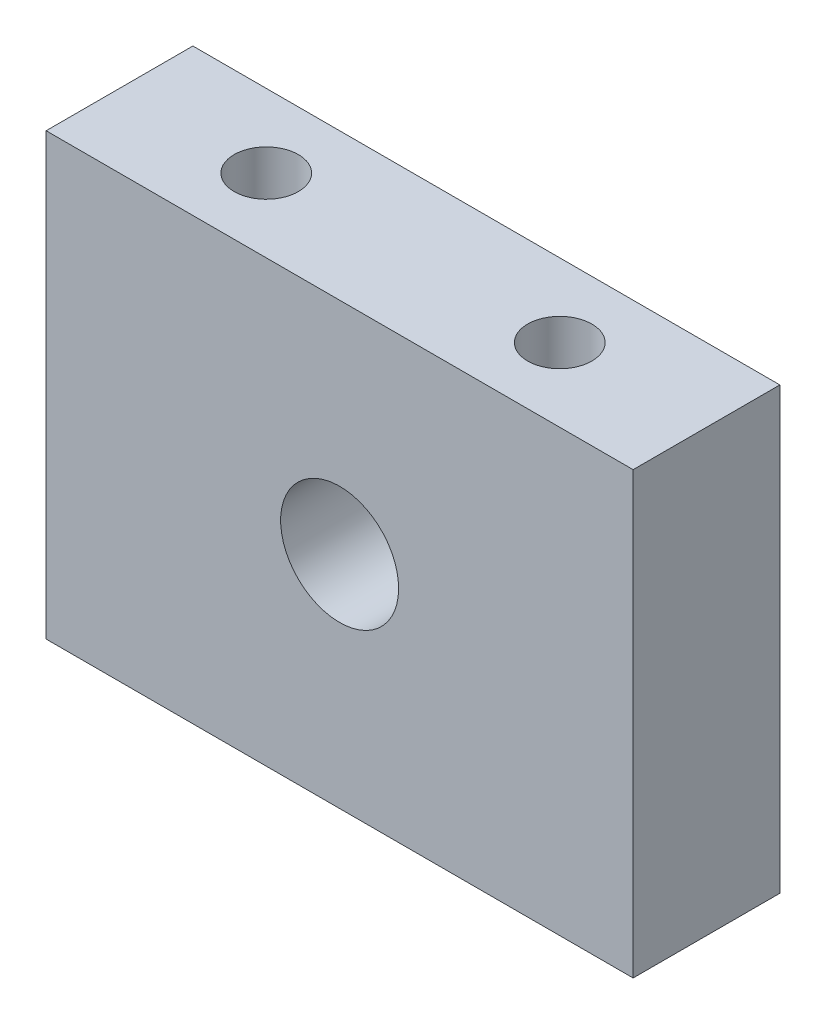
ISO-10303-21;
HEADER;
FILE_DESCRIPTION(('STEP AP214'),'2;1');
FILE_NAME('part.step','',(''),(''),'','','');
FILE_SCHEMA(('AUTOMOTIVE_DESIGN { 1 0 10303 214 1 1 1 1 }'));
ENDSEC;
DATA;
#1=APPLICATION_CONTEXT('core data for automotive mechanical design processes');
#2=APPLICATION_PROTOCOL_DEFINITION('international standard','automotive_design',2000,#1);
#3=PRODUCT_CONTEXT('',#1,'mechanical');
#4=PRODUCT('Part','Part','',(#3));
#5=PRODUCT_RELATED_PRODUCT_CATEGORY('part','',(#4));
#6=PRODUCT_DEFINITION_FORMATION('','',#4);
#7=PRODUCT_DEFINITION_CONTEXT('part definition',#1,'design');
#8=PRODUCT_DEFINITION('design','',#6,#7);
#9=PRODUCT_DEFINITION_SHAPE('','',#8);
#10=(LENGTH_UNIT() NAMED_UNIT(*) SI_UNIT(.MILLI.,.METRE.));
#11=(NAMED_UNIT(*) PLANE_ANGLE_UNIT() SI_UNIT($,.RADIAN.));
#12=(NAMED_UNIT(*) SI_UNIT($,.STERADIAN.) SOLID_ANGLE_UNIT());
#13=UNCERTAINTY_MEASURE_WITH_UNIT(LENGTH_MEASURE(1.E-05),#10,'distance_accuracy_value','');
#14=(GEOMETRIC_REPRESENTATION_CONTEXT(3) GLOBAL_UNCERTAINTY_ASSIGNED_CONTEXT((#13)) GLOBAL_UNIT_ASSIGNED_CONTEXT((#10,
#11,#12)) REPRESENTATION_CONTEXT('',''));
#15=CARTESIAN_POINT('',(0.,0.,0.));
#16=DIRECTION('',(0.,0.,1.));
#17=DIRECTION('',(1.,0.,0.));
#18=AXIS2_PLACEMENT_3D('',#15,#16,#17);
#19=CARTESIAN_POINT('',(6.35,3.175,0.));
#20=DIRECTION('',(0.,-1.,0.));
#21=DIRECTION('',(0.,0.,-1.));
#22=AXIS2_PLACEMENT_3D('',#19,#20,#21);
#23=PLANE('',#22);
#24=CARTESIAN_POINT('',(6.35,3.175,0.));
#25=DIRECTION('',(0.,1.,0.));
#26=DIRECTION('',(0.,0.,1.));
#27=AXIS2_PLACEMENT_3D('',#24,#25,#26);
#28=CIRCLE('',#27,1.3890625);
#29=CARTESIAN_POINT('',(6.35,3.175,1.3890625));
#30=VERTEX_POINT('',#29);
#31=EDGE_CURVE('E20',#30,#30,#28,.T.);
#32=ORIENTED_EDGE('',*,*,#31,.T.);
#33=EDGE_LOOP('',(#32));
#34=FACE_BOUND('',#33,.T.);
#35=ADVANCED_FACE('F17',(#34),#23,.F.);
#36=CARTESIAN_POINT('',(-6.35,3.175,0.));
#37=DIRECTION('',(0.,1.,0.));
#38=DIRECTION('',(0.,0.,1.));
#39=AXIS2_PLACEMENT_3D('',#36,#37,#38);
#40=PLANE('',#39);
#41=CARTESIAN_POINT('',(-6.35,3.175,0.));
#42=DIRECTION('',(0.,1.,0.));
#43=DIRECTION('',(0.,0.,1.));
#44=AXIS2_PLACEMENT_3D('',#41,#42,#43);
#45=CIRCLE('',#44,1.3890625);
#46=CARTESIAN_POINT('',(-6.35,3.175,1.3890625));
#47=VERTEX_POINT('',#46);
#48=EDGE_CURVE('E109',#47,#47,#45,.T.);
#49=ORIENTED_EDGE('',*,*,#48,.T.);
#50=EDGE_LOOP('',(#49));
#51=FACE_BOUND('',#50,.T.);
#52=ADVANCED_FACE('F175',(#51),#40,.T.);
#53=CARTESIAN_POINT('',(-6.34999999999999,-3.175,0.));
#54=DIRECTION('',(0.,1.,0.));
#55=DIRECTION('',(0.,0.,1.));
#56=AXIS2_PLACEMENT_3D('',#53,#54,#55);
#57=PLANE('',#56);
#58=CARTESIAN_POINT('',(-6.34999999999999,-3.175,0.));
#59=DIRECTION('',(0.,-1.,0.));
#60=DIRECTION('',(0.,0.,-1.));
#61=AXIS2_PLACEMENT_3D('',#58,#59,#60);
#62=CIRCLE('',#61,1.3890625);
#63=CARTESIAN_POINT('',(-6.34999999999999,-3.175,-1.3890625));
#64=VERTEX_POINT('',#63);
#65=EDGE_CURVE('E107',#64,#64,#62,.T.);
#66=ORIENTED_EDGE('',*,*,#65,.T.);
#67=EDGE_LOOP('',(#66));
#68=FACE_BOUND('',#67,.T.);
#69=ADVANCED_FACE('F172',(#68),#57,.F.);
#70=CARTESIAN_POINT('',(6.35,-3.175,0.));
#71=DIRECTION('',(0.,-1.,0.));
#72=DIRECTION('',(0.,0.,-1.));
#73=AXIS2_PLACEMENT_3D('',#70,#71,#72);
#74=PLANE('',#73);
#75=CARTESIAN_POINT('',(6.35,-3.175,0.));
#76=DIRECTION('',(0.,-1.,0.));
#77=DIRECTION('',(0.,0.,-1.));
#78=AXIS2_PLACEMENT_3D('',#75,#76,#77);
#79=CIRCLE('',#78,1.3890625);
#80=CARTESIAN_POINT('',(6.35,-3.175,-1.3890625));
#81=VERTEX_POINT('',#80);
#82=EDGE_CURVE('E104',#81,#81,#79,.T.);
#83=ORIENTED_EDGE('',*,*,#82,.T.);
#84=EDGE_LOOP('',(#83));
#85=FACE_BOUND('',#84,.T.);
#86=ADVANCED_FACE('F121',(#85),#74,.T.);
#87=CARTESIAN_POINT('',(6.35,3.175,0.));
#88=DIRECTION('',(0.,1.,0.));
#89=DIRECTION('',(0.,0.,1.));
#90=AXIS2_PLACEMENT_3D('',#87,#88,#89);
#91=CYLINDRICAL_SURFACE('',#90,1.3890625);
#92=ORIENTED_EDGE('',*,*,#31,.F.);
#93=EDGE_LOOP('',(#92));
#94=FACE_BOUND('',#93,.T.);
#95=CARTESIAN_POINT('',(6.35,9.525,0.));
#96=DIRECTION('',(0.,1.,0.));
#97=DIRECTION('',(0.,0.,1.));
#98=AXIS2_PLACEMENT_3D('',#95,#96,#97);
#99=CIRCLE('',#98,1.3890625);
#100=CARTESIAN_POINT('',(6.35,9.525,1.3890625));
#101=VERTEX_POINT('',#100);
#102=EDGE_CURVE('E69',#101,#101,#99,.T.);
#103=ORIENTED_EDGE('',*,*,#102,.T.);
#104=EDGE_LOOP('',(#103));
#105=FACE_BOUND('',#104,.T.);
#106=ADVANCED_FACE('F117',(#94,#105),#91,.F.);
#107=CARTESIAN_POINT('',(-6.35,3.175,0.));
#108=DIRECTION('',(0.,1.,0.));
#109=DIRECTION('',(0.,0.,1.));
#110=AXIS2_PLACEMENT_3D('',#107,#108,#109);
#111=CYLINDRICAL_SURFACE('',#110,1.3890625);
#112=ORIENTED_EDGE('',*,*,#48,.F.);
#113=EDGE_LOOP('',(#112));
#114=FACE_BOUND('',#113,.T.);
#115=CARTESIAN_POINT('',(-6.35,9.525,0.));
#116=DIRECTION('',(0.,1.,0.));
#117=DIRECTION('',(0.,0.,1.));
#118=AXIS2_PLACEMENT_3D('',#115,#116,#117);
#119=CIRCLE('',#118,1.3890625);
#120=CARTESIAN_POINT('',(-6.35,9.525,1.3890625));
#121=VERTEX_POINT('',#120);
#122=EDGE_CURVE('E83',#121,#121,#119,.T.);
#123=ORIENTED_EDGE('',*,*,#122,.T.);
#124=EDGE_LOOP('',(#123));
#125=FACE_BOUND('',#124,.T.);
#126=ADVANCED_FACE('F120',(#114,#125),#111,.F.);
#127=CARTESIAN_POINT('',(-6.34999999999999,-3.175,0.));
#128=DIRECTION('',(0.,-1.,0.));
#129=DIRECTION('',(0.,0.,-1.));
#130=AXIS2_PLACEMENT_3D('',#127,#128,#129);
#131=CYLINDRICAL_SURFACE('',#130,1.3890625);
#132=ORIENTED_EDGE('',*,*,#65,.F.);
#133=EDGE_LOOP('',(#132));
#134=FACE_BOUND('',#133,.T.);
#135=CARTESIAN_POINT('',(-6.34999999999999,-9.525,0.));
#136=DIRECTION('',(0.,-1.,0.));
#137=DIRECTION('',(0.,0.,-1.));
#138=AXIS2_PLACEMENT_3D('',#135,#136,#137);
#139=CIRCLE('',#138,1.3890625);
#140=CARTESIAN_POINT('',(-6.34999999999999,-9.525,-1.3890625));
#141=VERTEX_POINT('',#140);
#142=EDGE_CURVE('E97',#141,#141,#139,.T.);
#143=ORIENTED_EDGE('',*,*,#142,.T.);
#144=EDGE_LOOP('',(#143));
#145=FACE_BOUND('',#144,.T.);
#146=ADVANCED_FACE('F160',(#134,#145),#131,.F.);
#147=CARTESIAN_POINT('',(6.35,-3.175,0.));
#148=DIRECTION('',(0.,-1.,0.));
#149=DIRECTION('',(0.,0.,-1.));
#150=AXIS2_PLACEMENT_3D('',#147,#148,#149);
#151=CYLINDRICAL_SURFACE('',#150,1.3890625);
#152=ORIENTED_EDGE('',*,*,#82,.F.);
#153=EDGE_LOOP('',(#152));
#154=FACE_BOUND('',#153,.T.);
#155=CARTESIAN_POINT('',(6.35,-9.525,0.));
#156=DIRECTION('',(0.,-1.,0.));
#157=DIRECTION('',(0.,0.,-1.));
#158=AXIS2_PLACEMENT_3D('',#155,#156,#157);
#159=CIRCLE('',#158,1.3890625);
#160=CARTESIAN_POINT('',(6.35,-9.525,-1.3890625));
#161=VERTEX_POINT('',#160);
#162=EDGE_CURVE('E94',#161,#161,#159,.T.);
#163=ORIENTED_EDGE('',*,*,#162,.T.);
#164=EDGE_LOOP('',(#163));
#165=FACE_BOUND('',#164,.T.);
#166=ADVANCED_FACE('F155',(#154,#165),#151,.F.);
#167=CARTESIAN_POINT('',(0.,0.,-3.175));
#168=DIRECTION('',(0.,0.,1.));
#169=DIRECTION('',(1.,0.,0.));
#170=AXIS2_PLACEMENT_3D('',#167,#168,#169);
#171=PLANE('',#170);
#172=DIRECTION('',(1.,0.,0.));
#173=VECTOR('',#172,1.);
#174=CARTESIAN_POINT('',(-12.7,-9.525,-3.175));
#175=LINE('',#174,#173);
#176=CARTESIAN_POINT('',(12.7,-9.525,-3.175));
#177=VERTEX_POINT('',#176);
#178=CARTESIAN_POINT('',(-12.7,-9.525,-3.175));
#179=VERTEX_POINT('',#178);
#180=EDGE_CURVE('E93',#177,#179,#175,.F.);
#181=ORIENTED_EDGE('',*,*,#180,.T.);
#182=DIRECTION('',(0.,1.,0.));
#183=VECTOR('',#182,1.);
#184=CARTESIAN_POINT('',(-12.7,9.525,-3.175));
#185=LINE('',#184,#183);
#186=CARTESIAN_POINT('',(-12.7,9.525,-3.175));
#187=VERTEX_POINT('',#186);
#188=EDGE_CURVE('E74',#179,#187,#185,.T.);
#189=ORIENTED_EDGE('',*,*,#188,.T.);
#190=DIRECTION('',(1.,0.,0.));
#191=VECTOR('',#190,1.);
#192=CARTESIAN_POINT('',(-12.7,9.525,-3.175));
#193=LINE('',#192,#191);
#194=CARTESIAN_POINT('',(12.7,9.525,-3.175));
#195=VERTEX_POINT('',#194);
#196=EDGE_CURVE('E55',#187,#195,#193,.T.);
#197=ORIENTED_EDGE('',*,*,#196,.T.);
#198=DIRECTION('',(0.,-1.,0.));
#199=VECTOR('',#198,1.);
#200=CARTESIAN_POINT('',(12.7,9.525,-3.175));
#201=LINE('',#200,#199);
#202=EDGE_CURVE('E60',#195,#177,#201,.T.);
#203=ORIENTED_EDGE('',*,*,#202,.T.);
#204=EDGE_LOOP('',(#181,#189,#197,#203));
#205=FACE_BOUND('',#204,.T.);
#206=CARTESIAN_POINT('',(0.,0.,-3.175));
#207=DIRECTION('',(0.,0.,1.));
#208=DIRECTION('',(1.,0.,0.));
#209=AXIS2_PLACEMENT_3D('',#206,#207,#208);
#210=CIRCLE('',#209,2.5527);
#211=CARTESIAN_POINT('',(2.5527,0.,-3.175));
#212=VERTEX_POINT('',#211);
#213=EDGE_CURVE('E70',#212,#212,#210,.T.);
#214=ORIENTED_EDGE('',*,*,#213,.T.);
#215=EDGE_LOOP('',(#214));
#216=FACE_BOUND('',#215,.T.);
#217=ADVANCED_FACE('F72',(#205,#216),#171,.F.);
#218=CARTESIAN_POINT('',(0.,0.,-3.175));
#219=DIRECTION('',(0.,0.,1.));
#220=DIRECTION('',(1.,0.,0.));
#221=AXIS2_PLACEMENT_3D('',#218,#219,#220);
#222=CYLINDRICAL_SURFACE('',#221,2.5527);
#223=CARTESIAN_POINT('',(0.,0.,3.175));
#224=DIRECTION('',(0.,0.,1.));
#225=DIRECTION('',(1.,0.,0.));
#226=AXIS2_PLACEMENT_3D('',#223,#224,#225);
#227=CIRCLE('',#226,2.5527);
#228=CARTESIAN_POINT('',(2.5527,0.,3.175));
#229=VERTEX_POINT('',#228);
#230=EDGE_CURVE('E89',#229,#229,#227,.F.);
#231=ORIENTED_EDGE('',*,*,#230,.F.);
#232=EDGE_LOOP('',(#231));
#233=FACE_BOUND('',#232,.T.);
#234=ORIENTED_EDGE('',*,*,#213,.F.);
#235=EDGE_LOOP('',(#234));
#236=FACE_BOUND('',#235,.T.);
#237=ADVANCED_FACE('F135',(#233,#236),#222,.F.);
#238=CARTESIAN_POINT('',(12.7,9.525,3.175));
#239=DIRECTION('',(-1.,0.,0.));
#240=DIRECTION('',(0.,-1.,0.));
#241=AXIS2_PLACEMENT_3D('',#238,#239,#240);
#242=PLANE('',#241);
#243=DIRECTION('',(0.,0.,-1.));
#244=VECTOR('',#243,1.);
#245=CARTESIAN_POINT('',(12.7,9.525,3.175));
#246=LINE('',#245,#244);
#247=CARTESIAN_POINT('',(12.7,9.525,3.175));
#248=VERTEX_POINT('',#247);
#249=EDGE_CURVE('E62',#195,#248,#246,.F.);
#250=ORIENTED_EDGE('',*,*,#249,.T.);
#251=DIRECTION('',(0.,1.,0.));
#252=VECTOR('',#251,1.);
#253=CARTESIAN_POINT('',(12.7,0.,3.175));
#254=LINE('',#253,#252);
#255=CARTESIAN_POINT('',(12.7,-9.525,3.175));
#256=VERTEX_POINT('',#255);
#257=EDGE_CURVE('E92',#256,#248,#254,.T.);
#258=ORIENTED_EDGE('',*,*,#257,.F.);
#259=DIRECTION('',(0.,0.,1.));
#260=VECTOR('',#259,1.);
#261=CARTESIAN_POINT('',(12.7,-9.525,3.175));
#262=LINE('',#261,#260);
#263=EDGE_CURVE('E65',#256,#177,#262,.F.);
#264=ORIENTED_EDGE('',*,*,#263,.T.);
#265=ORIENTED_EDGE('',*,*,#202,.F.);
#266=EDGE_LOOP('',(#250,#258,#264,#265));
#267=FACE_BOUND('',#266,.T.);
#268=ADVANCED_FACE('F61',(#267),#242,.F.);
#269=CARTESIAN_POINT('',(-12.7,9.525,3.175));
#270=DIRECTION('',(0.,-1.,0.));
#271=DIRECTION('',(0.,0.,-1.));
#272=AXIS2_PLACEMENT_3D('',#269,#270,#271);
#273=PLANE('',#272);
#274=DIRECTION('',(0.,0.,1.));
#275=VECTOR('',#274,1.);
#276=CARTESIAN_POINT('',(-12.7,9.525,3.175));
#277=LINE('',#276,#275);
#278=CARTESIAN_POINT('',(-12.7,9.525,3.175));
#279=VERTEX_POINT('',#278);
#280=EDGE_CURVE('E76',#187,#279,#277,.T.);
#281=ORIENTED_EDGE('',*,*,#280,.T.);
#282=DIRECTION('',(1.,0.,0.));
#283=VECTOR('',#282,1.);
#284=CARTESIAN_POINT('',(0.,9.525,3.175));
#285=LINE('',#284,#283);
#286=EDGE_CURVE('E81',#248,#279,#285,.F.);
#287=ORIENTED_EDGE('',*,*,#286,.F.);
#288=ORIENTED_EDGE('',*,*,#249,.F.);
#289=ORIENTED_EDGE('',*,*,#196,.F.);
#290=EDGE_LOOP('',(#281,#287,#288,#289));
#291=FACE_BOUND('',#290,.T.);
#292=ORIENTED_EDGE('',*,*,#122,.F.);
#293=EDGE_LOOP('',(#292));
#294=FACE_BOUND('',#293,.T.);
#295=ORIENTED_EDGE('',*,*,#102,.F.);
#296=EDGE_LOOP('',(#295));
#297=FACE_BOUND('',#296,.T.);
#298=ADVANCED_FACE('F78',(#291,#294,#297),#273,.F.);
#299=CARTESIAN_POINT('',(-12.7,9.525,3.175));
#300=DIRECTION('',(1.,0.,0.));
#301=DIRECTION('',(0.,1.,0.));
#302=AXIS2_PLACEMENT_3D('',#299,#300,#301);
#303=PLANE('',#302);
#304=DIRECTION('',(0.,0.,1.));
#305=VECTOR('',#304,1.);
#306=CARTESIAN_POINT('',(-12.7,-9.525,3.175));
#307=LINE('',#306,#305);
#308=CARTESIAN_POINT('',(-12.7,-9.525,3.175));
#309=VERTEX_POINT('',#308);
#310=EDGE_CURVE('E35',#179,#309,#307,.T.);
#311=ORIENTED_EDGE('',*,*,#310,.T.);
#312=DIRECTION('',(0.,1.,0.));
#313=VECTOR('',#312,1.);
#314=CARTESIAN_POINT('',(-12.7,0.,3.175));
#315=LINE('',#314,#313);
#316=EDGE_CURVE('E26',#279,#309,#315,.F.);
#317=ORIENTED_EDGE('',*,*,#316,.F.);
#318=ORIENTED_EDGE('',*,*,#280,.F.);
#319=ORIENTED_EDGE('',*,*,#188,.F.);
#320=EDGE_LOOP('',(#311,#317,#318,#319));
#321=FACE_BOUND('',#320,.T.);
#322=ADVANCED_FACE('F126',(#321),#303,.F.);
#323=CARTESIAN_POINT('',(-12.7,-9.525,3.175));
#324=DIRECTION('',(0.,1.,0.));
#325=DIRECTION('',(0.,0.,1.));
#326=AXIS2_PLACEMENT_3D('',#323,#324,#325);
#327=PLANE('',#326);
#328=ORIENTED_EDGE('',*,*,#263,.F.);
#329=DIRECTION('',(1.,0.,0.));
#330=VECTOR('',#329,1.);
#331=CARTESIAN_POINT('',(0.,-9.525,3.175));
#332=LINE('',#331,#330);
#333=EDGE_CURVE('E11',#309,#256,#332,.T.);
#334=ORIENTED_EDGE('',*,*,#333,.F.);
#335=ORIENTED_EDGE('',*,*,#310,.F.);
#336=ORIENTED_EDGE('',*,*,#180,.F.);
#337=EDGE_LOOP('',(#328,#334,#335,#336));
#338=FACE_BOUND('',#337,.T.);
#339=ORIENTED_EDGE('',*,*,#162,.F.);
#340=EDGE_LOOP('',(#339));
#341=FACE_BOUND('',#340,.T.);
#342=ORIENTED_EDGE('',*,*,#142,.F.);
#343=EDGE_LOOP('',(#342));
#344=FACE_BOUND('',#343,.T.);
#345=ADVANCED_FACE('F133',(#338,#341,#344),#327,.F.);
#346=CARTESIAN_POINT('',(0.,0.,3.175));
#347=DIRECTION('',(0.,0.,1.));
#348=DIRECTION('',(1.,0.,0.));
#349=AXIS2_PLACEMENT_3D('',#346,#347,#348);
#350=PLANE('',#349);
#351=ORIENTED_EDGE('',*,*,#316,.T.);
#352=ORIENTED_EDGE('',*,*,#333,.T.);
#353=ORIENTED_EDGE('',*,*,#257,.T.);
#354=ORIENTED_EDGE('',*,*,#286,.T.);
#355=EDGE_LOOP('',(#351,#352,#353,#354));
#356=FACE_BOUND('',#355,.T.);
#357=ORIENTED_EDGE('',*,*,#230,.T.);
#358=EDGE_LOOP('',(#357));
#359=FACE_BOUND('',#358,.T.);
#360=ADVANCED_FACE('F137',(#356,#359),#350,.T.);
#361=CLOSED_SHELL('',(#35,#52,#69,#86,#106,#126,#146,#166,#217,#237,#268,#298,#322,#345,#360));
#362=MANIFOLD_SOLID_BREP('B1',#361);
#363=ADVANCED_BREP_SHAPE_REPRESENTATION('',(#18,#362),#14);
#364=SHAPE_DEFINITION_REPRESENTATION(#9,#363);
ENDSEC;
END-ISO-10303-21;
